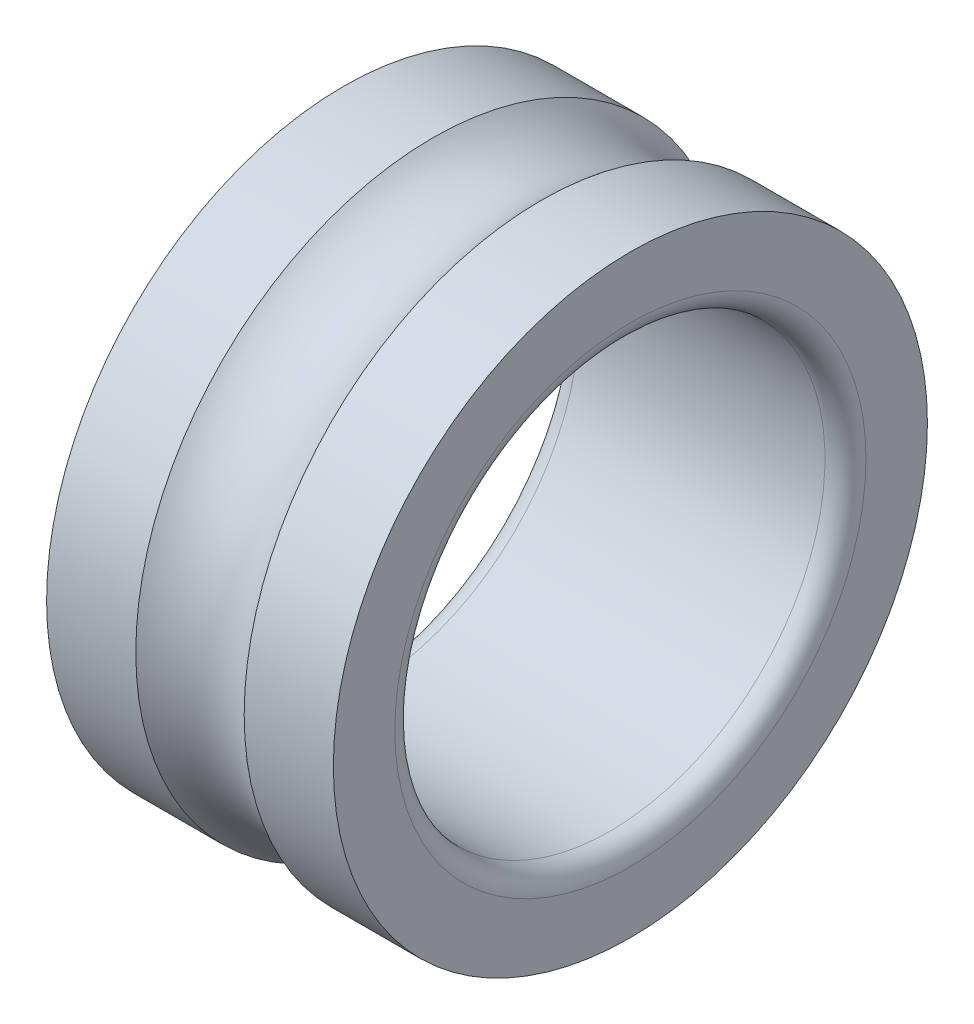
ISO-10303-21;
HEADER;
FILE_DESCRIPTION(('STEP AP214'),'2;1');
FILE_NAME('part.step','',(''),(''),'','','');
FILE_SCHEMA(('AUTOMOTIVE_DESIGN { 1 0 10303 214 1 1 1 1 }'));
ENDSEC;
DATA;
#1=APPLICATION_CONTEXT('core data for automotive mechanical design processes');
#2=APPLICATION_PROTOCOL_DEFINITION('international standard','automotive_design',2000,#1);
#3=PRODUCT_CONTEXT('',#1,'mechanical');
#4=PRODUCT('Part','Part','',(#3));
#5=PRODUCT_RELATED_PRODUCT_CATEGORY('part','',(#4));
#6=PRODUCT_DEFINITION_FORMATION('','',#4);
#7=PRODUCT_DEFINITION_CONTEXT('part definition',#1,'design');
#8=PRODUCT_DEFINITION('design','',#6,#7);
#9=PRODUCT_DEFINITION_SHAPE('','',#8);
#10=(LENGTH_UNIT() NAMED_UNIT(*) SI_UNIT(.MILLI.,.METRE.));
#11=(NAMED_UNIT(*) PLANE_ANGLE_UNIT() SI_UNIT($,.RADIAN.));
#12=(NAMED_UNIT(*) SI_UNIT($,.STERADIAN.) SOLID_ANGLE_UNIT());
#13=UNCERTAINTY_MEASURE_WITH_UNIT(LENGTH_MEASURE(1.E-05),#10,'distance_accuracy_value','');
#14=(GEOMETRIC_REPRESENTATION_CONTEXT(3) GLOBAL_UNCERTAINTY_ASSIGNED_CONTEXT((#13)) GLOBAL_UNIT_ASSIGNED_CONTEXT((#10,
#11,#12)) REPRESENTATION_CONTEXT('',''));
#15=CARTESIAN_POINT('',(0.,0.,0.));
#16=DIRECTION('',(0.,0.,1.));
#17=DIRECTION('',(1.,0.,0.));
#18=AXIS2_PLACEMENT_3D('',#15,#16,#17);
#19=CARTESIAN_POINT('',(0.,0.,0.));
#20=DIRECTION('',(-1.,0.,0.));
#21=DIRECTION('',(0.,0.,1.));
#22=AXIS2_PLACEMENT_3D('',#19,#20,#21);
#23=CYLINDRICAL_SURFACE('',#22,10.3571428571429);
#24=CARTESIAN_POINT('',(1.88982236504613,0.,0.));
#25=DIRECTION('',(-1.,0.,0.));
#26=DIRECTION('',(0.,0.,1.));
#27=AXIS2_PLACEMENT_3D('',#24,#25,#26);
#28=CIRCLE('',#27,10.3571428571429);
#29=CARTESIAN_POINT('',(1.88982236504613,0.,10.3571428571429));
#30=VERTEX_POINT('',#29);
#31=EDGE_CURVE('E376',#30,#30,#28,.T.);
#32=ORIENTED_EDGE('',*,*,#31,.F.);
#33=EDGE_LOOP('',(#32));
#34=FACE_BOUND('',#33,.T.);
#35=CARTESIAN_POINT('',(5.,0.,0.));
#36=DIRECTION('',(-1.,0.,0.));
#37=DIRECTION('',(0.,0.,1.));
#38=AXIS2_PLACEMENT_3D('',#35,#36,#37);
#39=CIRCLE('',#38,10.3571428571429);
#40=CARTESIAN_POINT('',(5.,0.,10.3571428571429));
#41=VERTEX_POINT('',#40);
#42=EDGE_CURVE('E10',#41,#41,#39,.T.);
#43=ORIENTED_EDGE('',*,*,#42,.T.);
#44=EDGE_LOOP('',(#43));
#45=FACE_BOUND('',#44,.T.);
#46=ADVANCED_FACE('F348',(#34,#45),#23,.T.);
#47=CARTESIAN_POINT('',(5.,8.21428571428571,0.));
#48=DIRECTION('',(-1.,0.,0.));
#49=DIRECTION('',(0.,0.,1.));
#50=AXIS2_PLACEMENT_3D('',#47,#48,#49);
#51=PLANE('',#50);
#52=ORIENTED_EDGE('',*,*,#42,.F.);
#53=EDGE_LOOP('',(#52));
#54=FACE_BOUND('',#53,.T.);
#55=CARTESIAN_POINT('',(5.,0.,0.));
#56=DIRECTION('',(-1.,0.,0.));
#57=DIRECTION('',(0.,0.,1.));
#58=AXIS2_PLACEMENT_3D('',#55,#56,#57);
#59=CIRCLE('',#58,8.21428571428571);
#60=CARTESIAN_POINT('',(5.,0.,8.21428571428571));
#61=VERTEX_POINT('',#60);
#62=EDGE_CURVE('E354',#61,#61,#59,.T.);
#63=ORIENTED_EDGE('',*,*,#62,.T.);
#64=EDGE_LOOP('',(#63));
#65=FACE_BOUND('',#64,.T.);
#66=ADVANCED_FACE('F383',(#54,#65),#51,.F.);
#67=CARTESIAN_POINT('',(4.28571428571429,0.,0.));
#68=DIRECTION('',(-1.,0.,0.));
#69=DIRECTION('',(0.,0.,1.));
#70=AXIS2_PLACEMENT_3D('',#67,#68,#69);
#71=TOROIDAL_SURFACE('',#70,8.21428571428571,0.714285714285714);
#72=ORIENTED_EDGE('',*,*,#62,.F.);
#73=EDGE_LOOP('',(#72));
#74=FACE_BOUND('',#73,.T.);
#75=CARTESIAN_POINT('',(4.28571428571429,0.,0.));
#76=DIRECTION('',(-1.,0.,0.));
#77=DIRECTION('',(0.,0.,1.));
#78=AXIS2_PLACEMENT_3D('',#75,#76,#77);
#79=CIRCLE('',#78,7.5);
#80=CARTESIAN_POINT('',(4.28571428571429,0.,7.5));
#81=VERTEX_POINT('',#80);
#82=EDGE_CURVE('E358',#81,#81,#79,.T.);
#83=ORIENTED_EDGE('',*,*,#82,.T.);
#84=EDGE_LOOP('',(#83));
#85=FACE_BOUND('',#84,.T.);
#86=ADVANCED_FACE('F387',(#74,#85),#71,.T.);
#87=CARTESIAN_POINT('',(0.,0.,0.));
#88=DIRECTION('',(-1.,0.,0.));
#89=DIRECTION('',(0.,0.,1.));
#90=AXIS2_PLACEMENT_3D('',#87,#88,#89);
#91=CYLINDRICAL_SURFACE('',#90,7.5);
#92=ORIENTED_EDGE('',*,*,#82,.F.);
#93=EDGE_LOOP('',(#92));
#94=FACE_BOUND('',#93,.T.);
#95=CARTESIAN_POINT('',(-4.28571428571429,0.,0.));
#96=DIRECTION('',(-1.,0.,0.));
#97=DIRECTION('',(0.,0.,1.));
#98=AXIS2_PLACEMENT_3D('',#95,#96,#97);
#99=CIRCLE('',#98,7.5);
#100=CARTESIAN_POINT('',(-4.28571428571429,0.,7.5));
#101=VERTEX_POINT('',#100);
#102=EDGE_CURVE('E362',#101,#101,#99,.T.);
#103=ORIENTED_EDGE('',*,*,#102,.T.);
#104=EDGE_LOOP('',(#103));
#105=FACE_BOUND('',#104,.T.);
#106=ADVANCED_FACE('F392',(#94,#105),#91,.F.);
#107=CARTESIAN_POINT('',(-4.28571428571429,0.,0.));
#108=DIRECTION('',(-1.,0.,0.));
#109=DIRECTION('',(0.,0.,1.));
#110=AXIS2_PLACEMENT_3D('',#107,#108,#109);
#111=TOROIDAL_SURFACE('',#110,8.21428571428571,0.714285714285715);
#112=ORIENTED_EDGE('',*,*,#102,.F.);
#113=EDGE_LOOP('',(#112));
#114=FACE_BOUND('',#113,.T.);
#115=CARTESIAN_POINT('',(-5.,0.,0.));
#116=DIRECTION('',(-1.,0.,0.));
#117=DIRECTION('',(0.,0.,1.));
#118=AXIS2_PLACEMENT_3D('',#115,#116,#117);
#119=CIRCLE('',#118,8.21428571428571);
#120=CARTESIAN_POINT('',(-5.,0.,8.21428571428571));
#121=VERTEX_POINT('',#120);
#122=EDGE_CURVE('E367',#121,#121,#119,.T.);
#123=ORIENTED_EDGE('',*,*,#122,.T.);
#124=EDGE_LOOP('',(#123));
#125=FACE_BOUND('',#124,.T.);
#126=ADVANCED_FACE('F398',(#114,#125),#111,.T.);
#127=CARTESIAN_POINT('',(-5.,8.21428571428571,0.));
#128=DIRECTION('',(1.,0.,0.));
#129=DIRECTION('',(0.,0.,-1.));
#130=AXIS2_PLACEMENT_3D('',#127,#128,#129);
#131=PLANE('',#130);
#132=ORIENTED_EDGE('',*,*,#122,.F.);
#133=EDGE_LOOP('',(#132));
#134=FACE_BOUND('',#133,.T.);
#135=CARTESIAN_POINT('',(-5.,0.,0.));
#136=DIRECTION('',(-1.,0.,0.));
#137=DIRECTION('',(0.,0.,1.));
#138=AXIS2_PLACEMENT_3D('',#135,#136,#137);
#139=CIRCLE('',#138,10.3571428571429);
#140=CARTESIAN_POINT('',(-5.,0.,10.3571428571429));
#141=VERTEX_POINT('',#140);
#142=EDGE_CURVE('E370',#141,#141,#139,.T.);
#143=ORIENTED_EDGE('',*,*,#142,.T.);
#144=EDGE_LOOP('',(#143));
#145=FACE_BOUND('',#144,.T.);
#146=ADVANCED_FACE('F402',(#134,#145),#131,.F.);
#147=CARTESIAN_POINT('',(0.,0.,0.));
#148=DIRECTION('',(-1.,0.,0.));
#149=DIRECTION('',(0.,0.,1.));
#150=AXIS2_PLACEMENT_3D('',#147,#148,#149);
#151=CYLINDRICAL_SURFACE('',#150,10.3571428571429);
#152=ORIENTED_EDGE('',*,*,#142,.F.);
#153=EDGE_LOOP('',(#152));
#154=FACE_BOUND('',#153,.T.);
#155=CARTESIAN_POINT('',(-1.88982236504613,0.,0.));
#156=DIRECTION('',(-1.,0.,0.));
#157=DIRECTION('',(0.,0.,1.));
#158=AXIS2_PLACEMENT_3D('',#155,#156,#157);
#159=CIRCLE('',#158,10.3571428571429);
#160=CARTESIAN_POINT('',(-1.88982236504613,0.,10.3571428571429));
#161=VERTEX_POINT('',#160);
#162=EDGE_CURVE('E373',#161,#161,#159,.T.);
#163=ORIENTED_EDGE('',*,*,#162,.T.);
#164=EDGE_LOOP('',(#163));
#165=FACE_BOUND('',#164,.T.);
#166=ADVANCED_FACE('F406',(#154,#165),#151,.T.);
#167=CARTESIAN_POINT('',(0.,0.,0.));
#168=DIRECTION('',(-1.,0.,0.));
#169=DIRECTION('',(0.,0.,1.));
#170=AXIS2_PLACEMENT_3D('',#167,#168,#169);
#171=TOROIDAL_SURFACE('',#170,12.5,2.85714285714286);
#172=ORIENTED_EDGE('',*,*,#162,.F.);
#173=EDGE_LOOP('',(#172));
#174=FACE_BOUND('',#173,.T.);
#175=ORIENTED_EDGE('',*,*,#31,.T.);
#176=EDGE_LOOP('',(#175));
#177=FACE_BOUND('',#176,.T.);
#178=ADVANCED_FACE('F380',(#174,#177),#171,.F.);
#179=CLOSED_SHELL('',(#46,#66,#86,#106,#126,#146,#166,#178));
#180=MANIFOLD_SOLID_BREP('B2',#179);
#181=ADVANCED_BREP_SHAPE_REPRESENTATION('',(#18,#180),#14);
#182=SHAPE_DEFINITION_REPRESENTATION(#9,#181);
ENDSEC;
END-ISO-10303-21;
